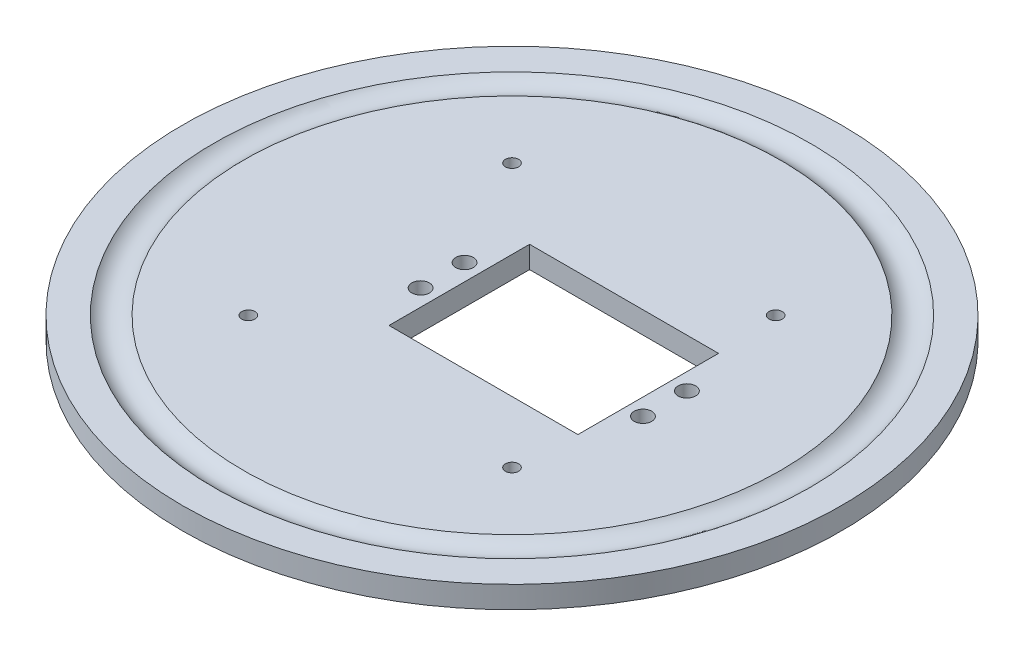
ISO-10303-21;
HEADER;
FILE_DESCRIPTION(('STEP AP214'),'2;1');
FILE_NAME('part.step','',(''),(''),'','','');
FILE_SCHEMA(('AUTOMOTIVE_DESIGN { 1 0 10303 214 1 1 1 1 }'));
ENDSEC;
DATA;
#1=APPLICATION_CONTEXT('core data for automotive mechanical design processes');
#2=APPLICATION_PROTOCOL_DEFINITION('international standard','automotive_design',2000,#1);
#3=PRODUCT_CONTEXT('',#1,'mechanical');
#4=PRODUCT('Part','Part','',(#3));
#5=PRODUCT_RELATED_PRODUCT_CATEGORY('part','',(#4));
#6=PRODUCT_DEFINITION_FORMATION('','',#4);
#7=PRODUCT_DEFINITION_CONTEXT('part definition',#1,'design');
#8=PRODUCT_DEFINITION('design','',#6,#7);
#9=PRODUCT_DEFINITION_SHAPE('','',#8);
#10=(LENGTH_UNIT() NAMED_UNIT(*) SI_UNIT(.MILLI.,.METRE.));
#11=(NAMED_UNIT(*) PLANE_ANGLE_UNIT() SI_UNIT($,.RADIAN.));
#12=(NAMED_UNIT(*) SI_UNIT($,.STERADIAN.) SOLID_ANGLE_UNIT());
#13=UNCERTAINTY_MEASURE_WITH_UNIT(LENGTH_MEASURE(1.E-05),#10,'distance_accuracy_value','');
#14=(GEOMETRIC_REPRESENTATION_CONTEXT(3) GLOBAL_UNCERTAINTY_ASSIGNED_CONTEXT((#13)) GLOBAL_UNIT_ASSIGNED_CONTEXT((#10,
#11,#12)) REPRESENTATION_CONTEXT('',''));
#15=CARTESIAN_POINT('',(0.,0.,0.));
#16=DIRECTION('',(0.,0.,1.));
#17=DIRECTION('',(1.,0.,0.));
#18=AXIS2_PLACEMENT_3D('',#15,#16,#17);
#19=CARTESIAN_POINT('',(0.,5.,0.));
#20=DIRECTION('',(0.,1.,0.));
#21=DIRECTION('',(0.,0.,1.));
#22=AXIS2_PLACEMENT_3D('',#19,#20,#21);
#23=PLANE('',#22);
#24=CARTESIAN_POINT('',(0.,5.,0.));
#25=DIRECTION('',(0.,1.,0.));
#26=DIRECTION('',(0.,0.,1.));
#27=AXIS2_PLACEMENT_3D('',#24,#25,#26);
#28=CIRCLE('',#27,75.);
#29=CARTESIAN_POINT('',(0.,5.,75.));
#30=VERTEX_POINT('',#29);
#31=EDGE_CURVE('E155',#30,#30,#28,.T.);
#32=ORIENTED_EDGE('',*,*,#31,.T.);
#33=EDGE_LOOP('',(#32));
#34=FACE_BOUND('',#33,.T.);
#35=CARTESIAN_POINT('',(0.,5.,0.));
#36=DIRECTION('',(0.,1.,0.));
#37=DIRECTION('',(0.,0.,1.));
#38=AXIS2_PLACEMENT_3D('',#35,#36,#37);
#39=CIRCLE('',#38,67.8541019662497);
#40=CARTESIAN_POINT('',(67.8541019662497,5.,0.));
#41=VERTEX_POINT('',#40);
#42=EDGE_CURVE('E12',#41,#41,#39,.F.);
#43=ORIENTED_EDGE('',*,*,#42,.T.);
#44=EDGE_LOOP('',(#43));
#45=FACE_BOUND('',#44,.T.);
#46=ADVANCED_FACE('F39',(#34,#45),#23,.T.);
#47=CARTESIAN_POINT('',(34.8,5.,5.));
#48=DIRECTION('',(0.,1.,0.));
#49=DIRECTION('',(0.,0.,1.));
#50=AXIS2_PLACEMENT_3D('',#47,#48,#49);
#51=CIRCLE('',#50,2.);
#52=CARTESIAN_POINT('',(34.8,5.,7.));
#53=VERTEX_POINT('',#52);
#54=EDGE_CURVE('E211',#53,#53,#51,.T.);
#55=ORIENTED_EDGE('',*,*,#54,.F.);
#56=EDGE_LOOP('',(#55));
#57=FACE_BOUND('',#56,.T.);
#58=CARTESIAN_POINT('',(-15.8,5.,-5.));
#59=DIRECTION('',(0.,1.,0.));
#60=DIRECTION('',(0.,0.,1.));
#61=AXIS2_PLACEMENT_3D('',#58,#59,#60);
#62=CIRCLE('',#61,2.);
#63=CARTESIAN_POINT('',(-15.8,5.,-3.));
#64=VERTEX_POINT('',#63);
#65=EDGE_CURVE('E214',#64,#64,#62,.T.);
#66=ORIENTED_EDGE('',*,*,#65,.F.);
#67=EDGE_LOOP('',(#66));
#68=FACE_BOUND('',#67,.T.);
#69=CARTESIAN_POINT('',(-15.8,5.,5.));
#70=DIRECTION('',(0.,1.,0.));
#71=DIRECTION('',(0.,0.,1.));
#72=AXIS2_PLACEMENT_3D('',#69,#70,#71);
#73=CIRCLE('',#72,2.);
#74=CARTESIAN_POINT('',(-15.8,5.,7.));
#75=VERTEX_POINT('',#74);
#76=EDGE_CURVE('E215',#75,#75,#73,.T.);
#77=ORIENTED_EDGE('',*,*,#76,.F.);
#78=EDGE_LOOP('',(#77));
#79=FACE_BOUND('',#78,.T.);
#80=CARTESIAN_POINT('',(34.8,5.,-5.));
#81=DIRECTION('',(0.,1.,0.));
#82=DIRECTION('',(0.,0.,1.));
#83=AXIS2_PLACEMENT_3D('',#80,#81,#82);
#84=CIRCLE('',#83,2.);
#85=CARTESIAN_POINT('',(34.8,5.,-3.));
#86=VERTEX_POINT('',#85);
#87=EDGE_CURVE('E113',#86,#86,#84,.T.);
#88=ORIENTED_EDGE('',*,*,#87,.F.);
#89=EDGE_LOOP('',(#88));
#90=FACE_BOUND('',#89,.T.);
#91=DIRECTION('',(0.,0.,1.));
#92=VECTOR('',#91,1.);
#93=CARTESIAN_POINT('',(-12.,5.,0.));
#94=LINE('',#93,#92);
#95=CARTESIAN_POINT('',(-12.,5.,-16.));
#96=VERTEX_POINT('',#95);
#97=CARTESIAN_POINT('',(-12.,5.,16.));
#98=VERTEX_POINT('',#97);
#99=EDGE_CURVE('E94',#96,#98,#94,.T.);
#100=ORIENTED_EDGE('',*,*,#99,.F.);
#101=DIRECTION('',(-1.,0.,0.));
#102=VECTOR('',#101,1.);
#103=CARTESIAN_POINT('',(-12.,5.,-16.));
#104=LINE('',#103,#102);
#105=CARTESIAN_POINT('',(31.,5.,-16.));
#106=VERTEX_POINT('',#105);
#107=EDGE_CURVE('E108',#106,#96,#104,.T.);
#108=ORIENTED_EDGE('',*,*,#107,.F.);
#109=DIRECTION('',(0.,0.,1.));
#110=VECTOR('',#109,1.);
#111=CARTESIAN_POINT('',(31.,5.,0.));
#112=LINE('',#111,#110);
#113=CARTESIAN_POINT('',(31.,5.,16.));
#114=VERTEX_POINT('',#113);
#115=EDGE_CURVE('E99',#106,#114,#112,.T.);
#116=ORIENTED_EDGE('',*,*,#115,.T.);
#117=DIRECTION('',(1.,0.,0.));
#118=VECTOR('',#117,1.);
#119=CARTESIAN_POINT('',(-12.,5.,16.));
#120=LINE('',#119,#118);
#121=EDGE_CURVE('E119',#98,#114,#120,.T.);
#122=ORIENTED_EDGE('',*,*,#121,.F.);
#123=EDGE_LOOP('',(#100,#108,#116,#122));
#124=FACE_BOUND('',#123,.T.);
#125=CARTESIAN_POINT('',(-30.,5.,-30.));
#126=DIRECTION('',(0.,1.,0.));
#127=DIRECTION('',(0.,0.,1.));
#128=AXIS2_PLACEMENT_3D('',#125,#126,#127);
#129=CIRCLE('',#128,1.5);
#130=CARTESIAN_POINT('',(-30.,5.,-28.5));
#131=VERTEX_POINT('',#130);
#132=EDGE_CURVE('E131',#131,#131,#129,.T.);
#133=ORIENTED_EDGE('',*,*,#132,.F.);
#134=EDGE_LOOP('',(#133));
#135=FACE_BOUND('',#134,.T.);
#136=CARTESIAN_POINT('',(30.,5.,-30.));
#137=DIRECTION('',(0.,1.,0.));
#138=DIRECTION('',(0.,0.,1.));
#139=AXIS2_PLACEMENT_3D('',#136,#137,#138);
#140=CIRCLE('',#139,1.5);
#141=CARTESIAN_POINT('',(30.,5.,-28.5));
#142=VERTEX_POINT('',#141);
#143=EDGE_CURVE('E132',#142,#142,#140,.T.);
#144=ORIENTED_EDGE('',*,*,#143,.F.);
#145=EDGE_LOOP('',(#144));
#146=FACE_BOUND('',#145,.T.);
#147=CARTESIAN_POINT('',(30.,5.,30.));
#148=DIRECTION('',(0.,1.,0.));
#149=DIRECTION('',(0.,0.,1.));
#150=AXIS2_PLACEMENT_3D('',#147,#148,#149);
#151=CIRCLE('',#150,1.5);
#152=CARTESIAN_POINT('',(30.,5.,31.5));
#153=VERTEX_POINT('',#152);
#154=EDGE_CURVE('E138',#153,#153,#151,.T.);
#155=ORIENTED_EDGE('',*,*,#154,.F.);
#156=EDGE_LOOP('',(#155));
#157=FACE_BOUND('',#156,.T.);
#158=CARTESIAN_POINT('',(-30.,5.,30.));
#159=DIRECTION('',(0.,1.,0.));
#160=DIRECTION('',(0.,0.,1.));
#161=AXIS2_PLACEMENT_3D('',#158,#159,#160);
#162=CIRCLE('',#161,1.5);
#163=CARTESIAN_POINT('',(-30.,5.,31.5));
#164=VERTEX_POINT('',#163);
#165=EDGE_CURVE('E127',#164,#164,#162,.T.);
#166=ORIENTED_EDGE('',*,*,#165,.F.);
#167=EDGE_LOOP('',(#166));
#168=FACE_BOUND('',#167,.T.);
#169=CARTESIAN_POINT('',(0.,5.,0.));
#170=DIRECTION('',(0.,-1.,0.));
#171=DIRECTION('',(0.,0.,-1.));
#172=AXIS2_PLACEMENT_3D('',#169,#170,#171);
#173=CIRCLE('',#172,61.1458980337503);
#174=CARTESIAN_POINT('',(61.1458980337503,5.,0.));
#175=VERTEX_POINT('',#174);
#176=EDGE_CURVE('E47',#175,#175,#173,.F.);
#177=ORIENTED_EDGE('',*,*,#176,.T.);
#178=EDGE_LOOP('',(#177));
#179=FACE_BOUND('',#178,.T.);
#180=ADVANCED_FACE('F161',(#57,#68,#79,#90,#124,#135,#146,#157,#168,#179),#23,.T.);
#181=CARTESIAN_POINT('',(0.,0.,0.));
#182=DIRECTION('',(0.,1.,0.));
#183=DIRECTION('',(0.,0.,1.));
#184=AXIS2_PLACEMENT_3D('',#181,#182,#183);
#185=PLANE('',#184);
#186=CARTESIAN_POINT('',(34.8,0.,5.));
#187=DIRECTION('',(0.,1.,0.));
#188=DIRECTION('',(0.,0.,1.));
#189=AXIS2_PLACEMENT_3D('',#186,#187,#188);
#190=CIRCLE('',#189,2.);
#191=CARTESIAN_POINT('',(34.8,0.,7.));
#192=VERTEX_POINT('',#191);
#193=EDGE_CURVE('E198',#192,#192,#190,.T.);
#194=ORIENTED_EDGE('',*,*,#193,.T.);
#195=EDGE_LOOP('',(#194));
#196=FACE_BOUND('',#195,.T.);
#197=CARTESIAN_POINT('',(-15.8,0.,-5.));
#198=DIRECTION('',(0.,1.,0.));
#199=DIRECTION('',(0.,0.,1.));
#200=AXIS2_PLACEMENT_3D('',#197,#198,#199);
#201=CIRCLE('',#200,2.);
#202=CARTESIAN_POINT('',(-15.8,0.,-3.));
#203=VERTEX_POINT('',#202);
#204=EDGE_CURVE('E202',#203,#203,#201,.T.);
#205=ORIENTED_EDGE('',*,*,#204,.T.);
#206=EDGE_LOOP('',(#205));
#207=FACE_BOUND('',#206,.T.);
#208=CARTESIAN_POINT('',(-15.8,0.,5.));
#209=DIRECTION('',(0.,1.,0.));
#210=DIRECTION('',(0.,0.,1.));
#211=AXIS2_PLACEMENT_3D('',#208,#209,#210);
#212=CIRCLE('',#211,2.);
#213=CARTESIAN_POINT('',(-15.8,0.,7.));
#214=VERTEX_POINT('',#213);
#215=EDGE_CURVE('E206',#214,#214,#212,.T.);
#216=ORIENTED_EDGE('',*,*,#215,.T.);
#217=EDGE_LOOP('',(#216));
#218=FACE_BOUND('',#217,.T.);
#219=CARTESIAN_POINT('',(34.8,0.,-5.));
#220=DIRECTION('',(0.,1.,0.));
#221=DIRECTION('',(0.,0.,1.));
#222=AXIS2_PLACEMENT_3D('',#219,#220,#221);
#223=CIRCLE('',#222,2.);
#224=CARTESIAN_POINT('',(34.8,0.,-3.));
#225=VERTEX_POINT('',#224);
#226=EDGE_CURVE('E122',#225,#225,#223,.T.);
#227=ORIENTED_EDGE('',*,*,#226,.T.);
#228=EDGE_LOOP('',(#227));
#229=FACE_BOUND('',#228,.T.);
#230=DIRECTION('',(-1.,0.,0.));
#231=VECTOR('',#230,1.);
#232=CARTESIAN_POINT('',(-12.,0.,-16.));
#233=LINE('',#232,#231);
#234=CARTESIAN_POINT('',(31.,0.,-16.));
#235=VERTEX_POINT('',#234);
#236=CARTESIAN_POINT('',(-12.,0.,-16.));
#237=VERTEX_POINT('',#236);
#238=EDGE_CURVE('E87',#235,#237,#233,.T.);
#239=ORIENTED_EDGE('',*,*,#238,.T.);
#240=DIRECTION('',(0.,0.,1.));
#241=VECTOR('',#240,1.);
#242=CARTESIAN_POINT('',(-12.,0.,0.));
#243=LINE('',#242,#241);
#244=CARTESIAN_POINT('',(-12.,0.,16.));
#245=VERTEX_POINT('',#244);
#246=EDGE_CURVE('E93',#237,#245,#243,.T.);
#247=ORIENTED_EDGE('',*,*,#246,.T.);
#248=DIRECTION('',(1.,0.,0.));
#249=VECTOR('',#248,1.);
#250=CARTESIAN_POINT('',(-12.,0.,16.));
#251=LINE('',#250,#249);
#252=CARTESIAN_POINT('',(31.,0.,16.));
#253=VERTEX_POINT('',#252);
#254=EDGE_CURVE('E89',#245,#253,#251,.T.);
#255=ORIENTED_EDGE('',*,*,#254,.T.);
#256=DIRECTION('',(0.,0.,1.));
#257=VECTOR('',#256,1.);
#258=CARTESIAN_POINT('',(31.,0.,0.));
#259=LINE('',#258,#257);
#260=EDGE_CURVE('E82',#235,#253,#259,.T.);
#261=ORIENTED_EDGE('',*,*,#260,.F.);
#262=EDGE_LOOP('',(#239,#247,#255,#261));
#263=FACE_BOUND('',#262,.T.);
#264=CARTESIAN_POINT('',(-30.,0.,30.));
#265=DIRECTION('',(0.,1.,0.));
#266=DIRECTION('',(0.,0.,1.));
#267=AXIS2_PLACEMENT_3D('',#264,#265,#266);
#268=CIRCLE('',#267,1.5);
#269=CARTESIAN_POINT('',(-30.,0.,31.5));
#270=VERTEX_POINT('',#269);
#271=EDGE_CURVE('E141',#270,#270,#268,.T.);
#272=ORIENTED_EDGE('',*,*,#271,.T.);
#273=EDGE_LOOP('',(#272));
#274=FACE_BOUND('',#273,.T.);
#275=CARTESIAN_POINT('',(30.,0.,30.));
#276=DIRECTION('',(0.,1.,0.));
#277=DIRECTION('',(0.,0.,1.));
#278=AXIS2_PLACEMENT_3D('',#275,#276,#277);
#279=CIRCLE('',#278,1.5);
#280=CARTESIAN_POINT('',(30.,0.,31.5));
#281=VERTEX_POINT('',#280);
#282=EDGE_CURVE('E135',#281,#281,#279,.T.);
#283=ORIENTED_EDGE('',*,*,#282,.T.);
#284=EDGE_LOOP('',(#283));
#285=FACE_BOUND('',#284,.T.);
#286=CARTESIAN_POINT('',(30.,0.,-30.));
#287=DIRECTION('',(0.,1.,0.));
#288=DIRECTION('',(0.,0.,1.));
#289=AXIS2_PLACEMENT_3D('',#286,#287,#288);
#290=CIRCLE('',#289,1.5);
#291=CARTESIAN_POINT('',(30.,0.,-28.5));
#292=VERTEX_POINT('',#291);
#293=EDGE_CURVE('E128',#292,#292,#290,.T.);
#294=ORIENTED_EDGE('',*,*,#293,.T.);
#295=EDGE_LOOP('',(#294));
#296=FACE_BOUND('',#295,.T.);
#297=CARTESIAN_POINT('',(-30.,0.,-30.));
#298=DIRECTION('',(0.,1.,0.));
#299=DIRECTION('',(0.,0.,1.));
#300=AXIS2_PLACEMENT_3D('',#297,#298,#299);
#301=CIRCLE('',#300,1.5);
#302=CARTESIAN_POINT('',(-30.,0.,-28.5));
#303=VERTEX_POINT('',#302);
#304=EDGE_CURVE('E146',#303,#303,#301,.T.);
#305=ORIENTED_EDGE('',*,*,#304,.T.);
#306=EDGE_LOOP('',(#305));
#307=FACE_BOUND('',#306,.T.);
#308=CARTESIAN_POINT('',(0.,0.,0.));
#309=DIRECTION('',(0.,1.,0.));
#310=DIRECTION('',(0.,0.,1.));
#311=AXIS2_PLACEMENT_3D('',#308,#309,#310);
#312=CIRCLE('',#311,75.);
#313=CARTESIAN_POINT('',(0.,0.,75.));
#314=VERTEX_POINT('',#313);
#315=EDGE_CURVE('E152',#314,#314,#312,.T.);
#316=ORIENTED_EDGE('',*,*,#315,.F.);
#317=EDGE_LOOP('',(#316));
#318=FACE_BOUND('',#317,.T.);
#319=ADVANCED_FACE('F84',(#196,#207,#218,#229,#263,#274,#285,#296,#307,#318),#185,.F.);
#320=CARTESIAN_POINT('',(0.,5.,0.));
#321=DIRECTION('',(0.,-1.,0.));
#322=DIRECTION('',(0.,0.,-1.));
#323=AXIS2_PLACEMENT_3D('',#320,#321,#322);
#324=CYLINDRICAL_SURFACE('',#323,75.);
#325=ORIENTED_EDGE('',*,*,#31,.F.);
#326=EDGE_LOOP('',(#325));
#327=FACE_BOUND('',#326,.T.);
#328=ORIENTED_EDGE('',*,*,#315,.T.);
#329=EDGE_LOOP('',(#328));
#330=FACE_BOUND('',#329,.T.);
#331=ADVANCED_FACE('F41',(#327,#330),#324,.T.);
#332=CARTESIAN_POINT('',(31.,0.,0.));
#333=DIRECTION('',(-1.,0.,0.));
#334=DIRECTION('',(0.,0.,1.));
#335=AXIS2_PLACEMENT_3D('',#332,#333,#334);
#336=PLANE('',#335);
#337=ORIENTED_EDGE('',*,*,#115,.F.);
#338=DIRECTION('',(0.,1.,0.));
#339=VECTOR('',#338,1.);
#340=CARTESIAN_POINT('',(31.,0.,-16.));
#341=LINE('',#340,#339);
#342=EDGE_CURVE('E97',#235,#106,#341,.T.);
#343=ORIENTED_EDGE('',*,*,#342,.F.);
#344=ORIENTED_EDGE('',*,*,#260,.T.);
#345=DIRECTION('',(0.,1.,0.));
#346=VECTOR('',#345,1.);
#347=CARTESIAN_POINT('',(31.,0.,16.));
#348=LINE('',#347,#346);
#349=EDGE_CURVE('E110',#253,#114,#348,.T.);
#350=ORIENTED_EDGE('',*,*,#349,.T.);
#351=EDGE_LOOP('',(#337,#343,#344,#350));
#352=FACE_BOUND('',#351,.T.);
#353=ADVANCED_FACE('F98',(#352),#336,.T.);
#354=CARTESIAN_POINT('',(-12.,0.,0.));
#355=DIRECTION('',(-1.,0.,0.));
#356=DIRECTION('',(0.,0.,1.));
#357=AXIS2_PLACEMENT_3D('',#354,#355,#356);
#358=PLANE('',#357);
#359=ORIENTED_EDGE('',*,*,#99,.T.);
#360=DIRECTION('',(0.,1.,0.));
#361=VECTOR('',#360,1.);
#362=CARTESIAN_POINT('',(-12.,0.,16.));
#363=LINE('',#362,#361);
#364=EDGE_CURVE('E118',#245,#98,#363,.T.);
#365=ORIENTED_EDGE('',*,*,#364,.F.);
#366=ORIENTED_EDGE('',*,*,#246,.F.);
#367=DIRECTION('',(0.,1.,0.));
#368=VECTOR('',#367,1.);
#369=CARTESIAN_POINT('',(-12.,0.,-16.));
#370=LINE('',#369,#368);
#371=EDGE_CURVE('E103',#237,#96,#370,.T.);
#372=ORIENTED_EDGE('',*,*,#371,.T.);
#373=EDGE_LOOP('',(#359,#365,#366,#372));
#374=FACE_BOUND('',#373,.T.);
#375=ADVANCED_FACE('F253',(#374),#358,.F.);
#376=CARTESIAN_POINT('',(-30.,0.,-30.));
#377=DIRECTION('',(0.,1.,0.));
#378=DIRECTION('',(0.,0.,1.));
#379=AXIS2_PLACEMENT_3D('',#376,#377,#378);
#380=CYLINDRICAL_SURFACE('',#379,1.5);
#381=ORIENTED_EDGE('',*,*,#304,.F.);
#382=EDGE_LOOP('',(#381));
#383=FACE_BOUND('',#382,.T.);
#384=ORIENTED_EDGE('',*,*,#132,.T.);
#385=EDGE_LOOP('',(#384));
#386=FACE_BOUND('',#385,.T.);
#387=ADVANCED_FACE('F248',(#383,#386),#380,.F.);
#388=CARTESIAN_POINT('',(30.,0.,-30.));
#389=DIRECTION('',(0.,1.,0.));
#390=DIRECTION('',(0.,0.,1.));
#391=AXIS2_PLACEMENT_3D('',#388,#389,#390);
#392=CYLINDRICAL_SURFACE('',#391,1.5);
#393=ORIENTED_EDGE('',*,*,#293,.F.);
#394=EDGE_LOOP('',(#393));
#395=FACE_BOUND('',#394,.T.);
#396=ORIENTED_EDGE('',*,*,#143,.T.);
#397=EDGE_LOOP('',(#396));
#398=FACE_BOUND('',#397,.T.);
#399=ADVANCED_FACE('F242',(#395,#398),#392,.F.);
#400=CARTESIAN_POINT('',(30.,0.,30.));
#401=DIRECTION('',(0.,1.,0.));
#402=DIRECTION('',(0.,0.,1.));
#403=AXIS2_PLACEMENT_3D('',#400,#401,#402);
#404=CYLINDRICAL_SURFACE('',#403,1.5);
#405=ORIENTED_EDGE('',*,*,#282,.F.);
#406=EDGE_LOOP('',(#405));
#407=FACE_BOUND('',#406,.T.);
#408=ORIENTED_EDGE('',*,*,#154,.T.);
#409=EDGE_LOOP('',(#408));
#410=FACE_BOUND('',#409,.T.);
#411=ADVANCED_FACE('F172',(#407,#410),#404,.F.);
#412=CARTESIAN_POINT('',(-30.,0.,30.));
#413=DIRECTION('',(0.,1.,0.));
#414=DIRECTION('',(0.,0.,1.));
#415=AXIS2_PLACEMENT_3D('',#412,#413,#414);
#416=CYLINDRICAL_SURFACE('',#415,1.5);
#417=ORIENTED_EDGE('',*,*,#271,.F.);
#418=EDGE_LOOP('',(#417));
#419=FACE_BOUND('',#418,.T.);
#420=ORIENTED_EDGE('',*,*,#165,.T.);
#421=EDGE_LOOP('',(#420));
#422=FACE_BOUND('',#421,.T.);
#423=ADVANCED_FACE('F164',(#419,#422),#416,.F.);
#424=CARTESIAN_POINT('',(0.,8.00000000000001,0.));
#425=DIRECTION('',(0.,1.,0.));
#426=DIRECTION('',(0.,0.,1.));
#427=AXIS2_PLACEMENT_3D('',#424,#425,#426);
#428=TOROIDAL_SURFACE('',#427,64.5,4.5);
#429=CARTESIAN_POINT('',(64.5,8.00000000000001,0.));
#430=DIRECTION('',(0.,0.,1.));
#431=DIRECTION('',(1.,0.,0.));
#432=AXIS2_PLACEMENT_3D('',#429,#430,#431);
#433=CIRCLE('',#432,4.5);
#434=EDGE_CURVE('E54',#175,#41,#433,.T.);
#435=ORIENTED_EDGE('',*,*,#434,.F.);
#436=ORIENTED_EDGE('',*,*,#176,.F.);
#437=ORIENTED_EDGE('',*,*,#434,.T.);
#438=ORIENTED_EDGE('',*,*,#42,.F.);
#439=EDGE_LOOP('',(#435,#436,#437,#438));
#440=FACE_BOUND('',#439,.T.);
#441=ADVANCED_FACE('F162',(#440),#428,.F.);
#442=CARTESIAN_POINT('',(-12.,0.,-16.));
#443=DIRECTION('',(0.,0.,-1.));
#444=DIRECTION('',(-1.,0.,0.));
#445=AXIS2_PLACEMENT_3D('',#442,#443,#444);
#446=PLANE('',#445);
#447=ORIENTED_EDGE('',*,*,#107,.T.);
#448=ORIENTED_EDGE('',*,*,#371,.F.);
#449=ORIENTED_EDGE('',*,*,#238,.F.);
#450=ORIENTED_EDGE('',*,*,#342,.T.);
#451=EDGE_LOOP('',(#447,#448,#449,#450));
#452=FACE_BOUND('',#451,.T.);
#453=ADVANCED_FACE('F106',(#452),#446,.F.);
#454=CARTESIAN_POINT('',(-12.,0.,16.));
#455=DIRECTION('',(0.,0.,1.));
#456=DIRECTION('',(1.,0.,0.));
#457=AXIS2_PLACEMENT_3D('',#454,#455,#456);
#458=PLANE('',#457);
#459=ORIENTED_EDGE('',*,*,#121,.T.);
#460=ORIENTED_EDGE('',*,*,#349,.F.);
#461=ORIENTED_EDGE('',*,*,#254,.F.);
#462=ORIENTED_EDGE('',*,*,#364,.T.);
#463=EDGE_LOOP('',(#459,#460,#461,#462));
#464=FACE_BOUND('',#463,.T.);
#465=ADVANCED_FACE('F170',(#464),#458,.F.);
#466=CARTESIAN_POINT('',(34.8,0.,-5.));
#467=DIRECTION('',(0.,1.,0.));
#468=DIRECTION('',(0.,0.,1.));
#469=AXIS2_PLACEMENT_3D('',#466,#467,#468);
#470=CYLINDRICAL_SURFACE('',#469,2.);
#471=ORIENTED_EDGE('',*,*,#226,.F.);
#472=EDGE_LOOP('',(#471));
#473=FACE_BOUND('',#472,.T.);
#474=ORIENTED_EDGE('',*,*,#87,.T.);
#475=EDGE_LOOP('',(#474));
#476=FACE_BOUND('',#475,.T.);
#477=ADVANCED_FACE('F263',(#473,#476),#470,.F.);
#478=CARTESIAN_POINT('',(-15.8,0.,5.));
#479=DIRECTION('',(0.,1.,0.));
#480=DIRECTION('',(0.,0.,1.));
#481=AXIS2_PLACEMENT_3D('',#478,#479,#480);
#482=CYLINDRICAL_SURFACE('',#481,2.);
#483=ORIENTED_EDGE('',*,*,#215,.F.);
#484=EDGE_LOOP('',(#483));
#485=FACE_BOUND('',#484,.T.);
#486=ORIENTED_EDGE('',*,*,#76,.T.);
#487=EDGE_LOOP('',(#486));
#488=FACE_BOUND('',#487,.T.);
#489=ADVANCED_FACE('F225',(#485,#488),#482,.F.);
#490=CARTESIAN_POINT('',(-15.8,0.,-5.));
#491=DIRECTION('',(0.,1.,0.));
#492=DIRECTION('',(0.,0.,1.));
#493=AXIS2_PLACEMENT_3D('',#490,#491,#492);
#494=CYLINDRICAL_SURFACE('',#493,2.);
#495=ORIENTED_EDGE('',*,*,#204,.F.);
#496=EDGE_LOOP('',(#495));
#497=FACE_BOUND('',#496,.T.);
#498=ORIENTED_EDGE('',*,*,#65,.T.);
#499=EDGE_LOOP('',(#498));
#500=FACE_BOUND('',#499,.T.);
#501=ADVANCED_FACE('F269',(#497,#500),#494,.F.);
#502=CARTESIAN_POINT('',(34.8,0.,5.));
#503=DIRECTION('',(0.,1.,0.));
#504=DIRECTION('',(0.,0.,1.));
#505=AXIS2_PLACEMENT_3D('',#502,#503,#504);
#506=CYLINDRICAL_SURFACE('',#505,2.);
#507=ORIENTED_EDGE('',*,*,#193,.F.);
#508=EDGE_LOOP('',(#507));
#509=FACE_BOUND('',#508,.T.);
#510=ORIENTED_EDGE('',*,*,#54,.T.);
#511=EDGE_LOOP('',(#510));
#512=FACE_BOUND('',#511,.T.);
#513=ADVANCED_FACE('F272',(#509,#512),#506,.F.);
#514=CLOSED_SHELL('',(#46,#180,#319,#331,#353,#375,#387,#399,#411,#423,#441,#453,#465,#477,#489,
#501,#513));
#515=MANIFOLD_SOLID_BREP('B2',#514);
#516=ADVANCED_BREP_SHAPE_REPRESENTATION('',(#18,#515),#14);
#517=SHAPE_DEFINITION_REPRESENTATION(#9,#516);
ENDSEC;
END-ISO-10303-21;
